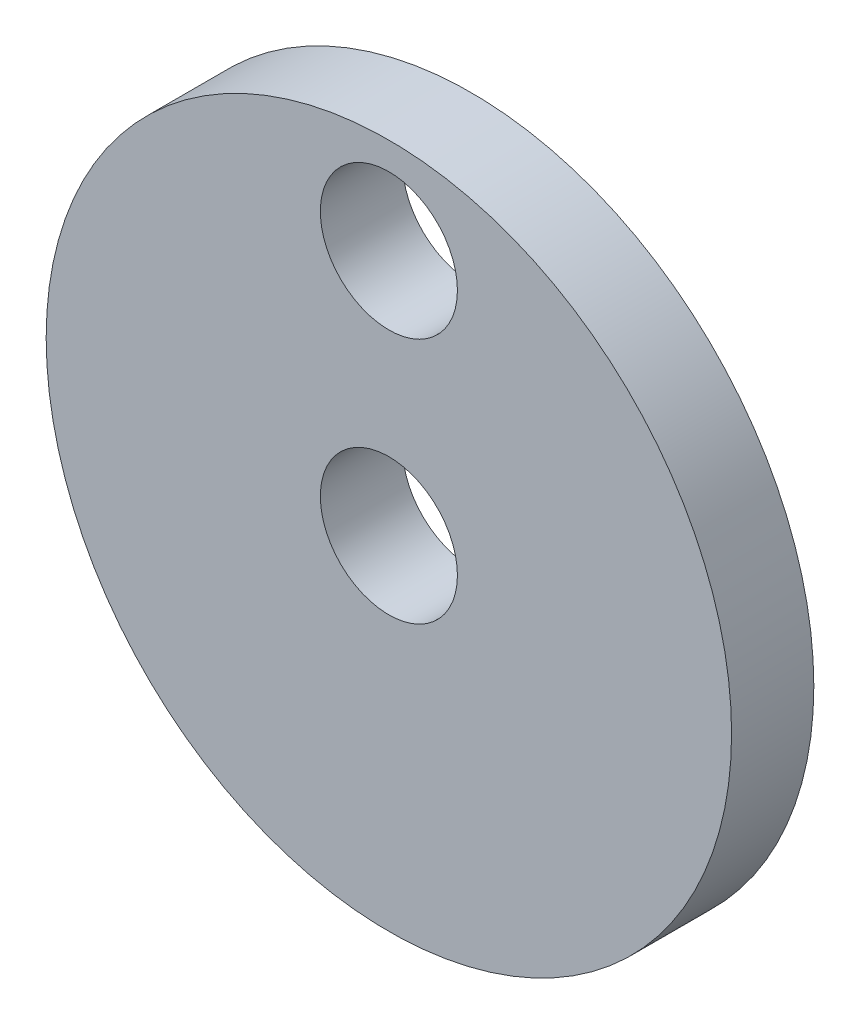
ISO-10303-21;
HEADER;
FILE_DESCRIPTION(('STEP AP214'),'2;1');
FILE_NAME('part.step','',(''),(''),'','','');
FILE_SCHEMA(('AUTOMOTIVE_DESIGN { 1 0 10303 214 1 1 1 1 }'));
ENDSEC;
DATA;
#1=APPLICATION_CONTEXT('core data for automotive mechanical design processes');
#2=APPLICATION_PROTOCOL_DEFINITION('international standard','automotive_design',2000,#1);
#3=PRODUCT_CONTEXT('',#1,'mechanical');
#4=PRODUCT('Part','Part','',(#3));
#5=PRODUCT_RELATED_PRODUCT_CATEGORY('part','',(#4));
#6=PRODUCT_DEFINITION_FORMATION('','',#4);
#7=PRODUCT_DEFINITION_CONTEXT('part definition',#1,'design');
#8=PRODUCT_DEFINITION('design','',#6,#7);
#9=PRODUCT_DEFINITION_SHAPE('','',#8);
#10=(LENGTH_UNIT() NAMED_UNIT(*) SI_UNIT(.MILLI.,.METRE.));
#11=(NAMED_UNIT(*) PLANE_ANGLE_UNIT() SI_UNIT($,.RADIAN.));
#12=(NAMED_UNIT(*) SI_UNIT($,.STERADIAN.) SOLID_ANGLE_UNIT());
#13=UNCERTAINTY_MEASURE_WITH_UNIT(LENGTH_MEASURE(1.E-05),#10,'distance_accuracy_value','');
#14=(GEOMETRIC_REPRESENTATION_CONTEXT(3) GLOBAL_UNCERTAINTY_ASSIGNED_CONTEXT((#13)) GLOBAL_UNIT_ASSIGNED_CONTEXT((#10,
#11,#12)) REPRESENTATION_CONTEXT('',''));
#15=CARTESIAN_POINT('',(0.,0.,0.));
#16=DIRECTION('',(0.,0.,1.));
#17=DIRECTION('',(1.,0.,0.));
#18=AXIS2_PLACEMENT_3D('',#15,#16,#17);
#19=CARTESIAN_POINT('',(0.,0.,3.));
#20=DIRECTION('',(0.,0.,1.));
#21=DIRECTION('',(1.,0.,0.));
#22=AXIS2_PLACEMENT_3D('',#19,#20,#21);
#23=PLANE('',#22);
#24=CARTESIAN_POINT('',(0.,0.,3.));
#25=DIRECTION('',(0.,0.,1.));
#26=DIRECTION('',(1.,0.,0.));
#27=AXIS2_PLACEMENT_3D('',#24,#25,#26);
#28=CIRCLE('',#27,2.5);
#29=CARTESIAN_POINT('',(2.5,0.,3.));
#30=VERTEX_POINT('',#29);
#31=EDGE_CURVE('E42',#30,#30,#28,.T.);
#32=ORIENTED_EDGE('',*,*,#31,.F.);
#33=EDGE_LOOP('',(#32));
#34=FACE_BOUND('',#33,.T.);
#35=CARTESIAN_POINT('',(0.,0.,3.));
#36=DIRECTION('',(0.,0.,1.));
#37=DIRECTION('',(1.,0.,0.));
#38=AXIS2_PLACEMENT_3D('',#35,#36,#37);
#39=CIRCLE('',#38,12.5);
#40=CARTESIAN_POINT('',(12.5,0.,3.));
#41=VERTEX_POINT('',#40);
#42=EDGE_CURVE('E10',#41,#41,#39,.T.);
#43=ORIENTED_EDGE('',*,*,#42,.T.);
#44=EDGE_LOOP('',(#43));
#45=FACE_BOUND('',#44,.T.);
#46=CARTESIAN_POINT('',(0.,9.,3.));
#47=DIRECTION('',(0.,0.,1.));
#48=DIRECTION('',(1.,0.,0.));
#49=AXIS2_PLACEMENT_3D('',#46,#47,#48);
#50=CIRCLE('',#49,2.5);
#51=CARTESIAN_POINT('',(2.5,9.,3.));
#52=VERTEX_POINT('',#51);
#53=EDGE_CURVE('E47',#52,#52,#50,.T.);
#54=ORIENTED_EDGE('',*,*,#53,.F.);
#55=EDGE_LOOP('',(#54));
#56=FACE_BOUND('',#55,.T.);
#57=ADVANCED_FACE('F31',(#34,#45,#56),#23,.T.);
#58=CARTESIAN_POINT('',(0.,0.,0.));
#59=DIRECTION('',(0.,0.,1.));
#60=DIRECTION('',(1.,0.,0.));
#61=AXIS2_PLACEMENT_3D('',#58,#59,#60);
#62=PLANE('',#61);
#63=CARTESIAN_POINT('',(0.,0.,0.));
#64=DIRECTION('',(0.,0.,1.));
#65=DIRECTION('',(1.,0.,0.));
#66=AXIS2_PLACEMENT_3D('',#63,#64,#65);
#67=CIRCLE('',#66,12.5);
#68=CARTESIAN_POINT('',(12.5,0.,0.));
#69=VERTEX_POINT('',#68);
#70=EDGE_CURVE('E35',#69,#69,#67,.T.);
#71=ORIENTED_EDGE('',*,*,#70,.F.);
#72=EDGE_LOOP('',(#71));
#73=FACE_BOUND('',#72,.T.);
#74=CARTESIAN_POINT('',(0.,0.,0.));
#75=DIRECTION('',(0.,0.,1.));
#76=DIRECTION('',(1.,0.,0.));
#77=AXIS2_PLACEMENT_3D('',#74,#75,#76);
#78=CIRCLE('',#77,2.5);
#79=CARTESIAN_POINT('',(2.5,0.,0.));
#80=VERTEX_POINT('',#79);
#81=EDGE_CURVE('E44',#80,#80,#78,.T.);
#82=ORIENTED_EDGE('',*,*,#81,.T.);
#83=EDGE_LOOP('',(#82));
#84=FACE_BOUND('',#83,.T.);
#85=CARTESIAN_POINT('',(0.,9.,0.));
#86=DIRECTION('',(0.,0.,1.));
#87=DIRECTION('',(1.,0.,0.));
#88=AXIS2_PLACEMENT_3D('',#85,#86,#87);
#89=CIRCLE('',#88,2.5);
#90=CARTESIAN_POINT('',(2.5,9.,0.));
#91=VERTEX_POINT('',#90);
#92=EDGE_CURVE('E50',#91,#91,#89,.T.);
#93=ORIENTED_EDGE('',*,*,#92,.T.);
#94=EDGE_LOOP('',(#93));
#95=FACE_BOUND('',#94,.T.);
#96=ADVANCED_FACE('F60',(#73,#84,#95),#62,.F.);
#97=CARTESIAN_POINT('',(0.,0.,3.));
#98=DIRECTION('',(0.,0.,-1.));
#99=DIRECTION('',(-1.,0.,0.));
#100=AXIS2_PLACEMENT_3D('',#97,#98,#99);
#101=CYLINDRICAL_SURFACE('',#100,12.5);
#102=ORIENTED_EDGE('',*,*,#42,.F.);
#103=EDGE_LOOP('',(#102));
#104=FACE_BOUND('',#103,.T.);
#105=ORIENTED_EDGE('',*,*,#70,.T.);
#106=EDGE_LOOP('',(#105));
#107=FACE_BOUND('',#106,.T.);
#108=ADVANCED_FACE('F33',(#104,#107),#101,.T.);
#109=CARTESIAN_POINT('',(0.,0.,3.));
#110=DIRECTION('',(0.,0.,-1.));
#111=DIRECTION('',(-1.,0.,0.));
#112=AXIS2_PLACEMENT_3D('',#109,#110,#111);
#113=CYLINDRICAL_SURFACE('',#112,2.5);
#114=ORIENTED_EDGE('',*,*,#31,.T.);
#115=EDGE_LOOP('',(#114));
#116=FACE_BOUND('',#115,.T.);
#117=ORIENTED_EDGE('',*,*,#81,.F.);
#118=EDGE_LOOP('',(#117));
#119=FACE_BOUND('',#118,.T.);
#120=ADVANCED_FACE('F69',(#116,#119),#113,.F.);
#121=CARTESIAN_POINT('',(0.,9.,3.));
#122=DIRECTION('',(0.,0.,-1.));
#123=DIRECTION('',(-1.,0.,0.));
#124=AXIS2_PLACEMENT_3D('',#121,#122,#123);
#125=CYLINDRICAL_SURFACE('',#124,2.5);
#126=ORIENTED_EDGE('',*,*,#53,.T.);
#127=EDGE_LOOP('',(#126));
#128=FACE_BOUND('',#127,.T.);
#129=ORIENTED_EDGE('',*,*,#92,.F.);
#130=EDGE_LOOP('',(#129));
#131=FACE_BOUND('',#130,.T.);
#132=ADVANCED_FACE('F56',(#128,#131),#125,.F.);
#133=CLOSED_SHELL('',(#57,#96,#108,#120,#132));
#134=MANIFOLD_SOLID_BREP('B2',#133);
#135=ADVANCED_BREP_SHAPE_REPRESENTATION('',(#18,#134),#14);
#136=SHAPE_DEFINITION_REPRESENTATION(#9,#135);
ENDSEC;
END-ISO-10303-21;
